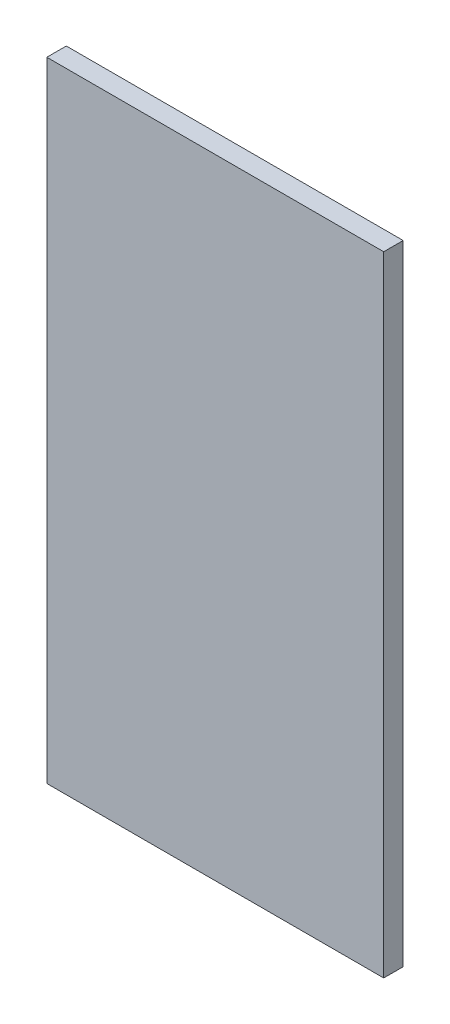
ISO-10303-21;
HEADER;
FILE_DESCRIPTION(('STEP AP214'),'2;1');
FILE_NAME('part.step','',(''),(''),'','','');
FILE_SCHEMA(('AUTOMOTIVE_DESIGN { 1 0 10303 214 1 1 1 1 }'));
ENDSEC;
DATA;
#1=APPLICATION_CONTEXT('core data for automotive mechanical design processes');
#2=APPLICATION_PROTOCOL_DEFINITION('international standard','automotive_design',2000,#1);
#3=PRODUCT_CONTEXT('',#1,'mechanical');
#4=PRODUCT('Part','Part','',(#3));
#5=PRODUCT_RELATED_PRODUCT_CATEGORY('part','',(#4));
#6=PRODUCT_DEFINITION_FORMATION('','',#4);
#7=PRODUCT_DEFINITION_CONTEXT('part definition',#1,'design');
#8=PRODUCT_DEFINITION('design','',#6,#7);
#9=PRODUCT_DEFINITION_SHAPE('','',#8);
#10=(LENGTH_UNIT() NAMED_UNIT(*) SI_UNIT(.MILLI.,.METRE.));
#11=(NAMED_UNIT(*) PLANE_ANGLE_UNIT() SI_UNIT($,.RADIAN.));
#12=(NAMED_UNIT(*) SI_UNIT($,.STERADIAN.) SOLID_ANGLE_UNIT());
#13=UNCERTAINTY_MEASURE_WITH_UNIT(LENGTH_MEASURE(1.E-05),#10,'distance_accuracy_value','');
#14=(GEOMETRIC_REPRESENTATION_CONTEXT(3) GLOBAL_UNCERTAINTY_ASSIGNED_CONTEXT((#13)) GLOBAL_UNIT_ASSIGNED_CONTEXT((#10,
#11,#12)) REPRESENTATION_CONTEXT('',''));
#15=CARTESIAN_POINT('',(0.,0.,0.));
#16=DIRECTION('',(0.,0.,1.));
#17=DIRECTION('',(1.,0.,0.));
#18=AXIS2_PLACEMENT_3D('',#15,#16,#17);
#19=CARTESIAN_POINT('',(-173.,323.,20.));
#20=DIRECTION('',(1.,0.,0.));
#21=DIRECTION('',(0.,0.,-1.));
#22=AXIS2_PLACEMENT_3D('',#19,#20,#21);
#23=PLANE('',#22);
#24=DIRECTION('',(0.,-1.,0.));
#25=VECTOR('',#24,1.);
#26=CARTESIAN_POINT('',(-173.,323.,0.));
#27=LINE('',#26,#25);
#28=CARTESIAN_POINT('',(-173.,323.,0.));
#29=VERTEX_POINT('',#28);
#30=CARTESIAN_POINT('',(-173.,-323.,0.));
#31=VERTEX_POINT('',#30);
#32=EDGE_CURVE('E96',#29,#31,#27,.T.);
#33=ORIENTED_EDGE('',*,*,#32,.T.);
#34=DIRECTION('',(0.,0.,-1.));
#35=VECTOR('',#34,1.);
#36=CARTESIAN_POINT('',(-173.,-323.,20.));
#37=LINE('',#36,#35);
#38=CARTESIAN_POINT('',(-173.,-323.,20.));
#39=VERTEX_POINT('',#38);
#40=EDGE_CURVE('E11',#39,#31,#37,.T.);
#41=ORIENTED_EDGE('',*,*,#40,.F.);
#42=DIRECTION('',(0.,-1.,0.));
#43=VECTOR('',#42,1.);
#44=CARTESIAN_POINT('',(-173.,323.,20.));
#45=LINE('',#44,#43);
#46=CARTESIAN_POINT('',(-173.,323.,20.));
#47=VERTEX_POINT('',#46);
#48=EDGE_CURVE('E84',#47,#39,#45,.T.);
#49=ORIENTED_EDGE('',*,*,#48,.F.);
#50=DIRECTION('',(0.,0.,-1.));
#51=VECTOR('',#50,1.);
#52=CARTESIAN_POINT('',(-173.,323.,20.));
#53=LINE('',#52,#51);
#54=EDGE_CURVE('E92',#47,#29,#53,.T.);
#55=ORIENTED_EDGE('',*,*,#54,.T.);
#56=EDGE_LOOP('',(#33,#41,#49,#55));
#57=FACE_BOUND('',#56,.T.);
#58=ADVANCED_FACE('F33',(#57),#23,.F.);
#59=CARTESIAN_POINT('',(-173.,-323.,20.));
#60=DIRECTION('',(0.,1.,0.));
#61=DIRECTION('',(0.,0.,1.));
#62=AXIS2_PLACEMENT_3D('',#59,#60,#61);
#63=PLANE('',#62);
#64=DIRECTION('',(1.,0.,0.));
#65=VECTOR('',#64,1.);
#66=CARTESIAN_POINT('',(-173.,-323.,0.));
#67=LINE('',#66,#65);
#68=CARTESIAN_POINT('',(173.,-323.,0.));
#69=VERTEX_POINT('',#68);
#70=EDGE_CURVE('E88',#31,#69,#67,.T.);
#71=ORIENTED_EDGE('',*,*,#70,.T.);
#72=DIRECTION('',(0.,0.,-1.));
#73=VECTOR('',#72,1.);
#74=CARTESIAN_POINT('',(173.,-323.,20.));
#75=LINE('',#74,#73);
#76=CARTESIAN_POINT('',(173.,-323.,20.));
#77=VERTEX_POINT('',#76);
#78=EDGE_CURVE('E41',#77,#69,#75,.T.);
#79=ORIENTED_EDGE('',*,*,#78,.F.);
#80=DIRECTION('',(1.,0.,0.));
#81=VECTOR('',#80,1.);
#82=CARTESIAN_POINT('',(-173.,-323.,20.));
#83=LINE('',#82,#81);
#84=EDGE_CURVE('E79',#39,#77,#83,.T.);
#85=ORIENTED_EDGE('',*,*,#84,.F.);
#86=ORIENTED_EDGE('',*,*,#40,.T.);
#87=EDGE_LOOP('',(#71,#79,#85,#86));
#88=FACE_BOUND('',#87,.T.);
#89=ADVANCED_FACE('F87',(#88),#63,.F.);
#90=CARTESIAN_POINT('',(173.,323.,20.));
#91=DIRECTION('',(-1.,0.,0.));
#92=DIRECTION('',(0.,0.,1.));
#93=AXIS2_PLACEMENT_3D('',#90,#91,#92);
#94=PLANE('',#93);
#95=DIRECTION('',(0.,1.,0.));
#96=VECTOR('',#95,1.);
#97=CARTESIAN_POINT('',(173.,323.,0.));
#98=LINE('',#97,#96);
#99=CARTESIAN_POINT('',(173.,323.,0.));
#100=VERTEX_POINT('',#99);
#101=EDGE_CURVE('E66',#69,#100,#98,.T.);
#102=ORIENTED_EDGE('',*,*,#101,.T.);
#103=DIRECTION('',(0.,0.,-1.));
#104=VECTOR('',#103,1.);
#105=CARTESIAN_POINT('',(173.,323.,20.));
#106=LINE('',#105,#104);
#107=CARTESIAN_POINT('',(173.,323.,20.));
#108=VERTEX_POINT('',#107);
#109=EDGE_CURVE('E89',#108,#100,#106,.T.);
#110=ORIENTED_EDGE('',*,*,#109,.F.);
#111=DIRECTION('',(0.,1.,0.));
#112=VECTOR('',#111,1.);
#113=CARTESIAN_POINT('',(173.,323.,20.));
#114=LINE('',#113,#112);
#115=EDGE_CURVE('E82',#77,#108,#114,.T.);
#116=ORIENTED_EDGE('',*,*,#115,.F.);
#117=ORIENTED_EDGE('',*,*,#78,.T.);
#118=EDGE_LOOP('',(#102,#110,#116,#117));
#119=FACE_BOUND('',#118,.T.);
#120=ADVANCED_FACE('F90',(#119),#94,.F.);
#121=CARTESIAN_POINT('',(-173.,323.,20.));
#122=DIRECTION('',(0.,-1.,0.));
#123=DIRECTION('',(0.,0.,-1.));
#124=AXIS2_PLACEMENT_3D('',#121,#122,#123);
#125=PLANE('',#124);
#126=DIRECTION('',(-1.,0.,0.));
#127=VECTOR('',#126,1.);
#128=CARTESIAN_POINT('',(-173.,323.,0.));
#129=LINE('',#128,#127);
#130=EDGE_CURVE('E72',#100,#29,#129,.T.);
#131=ORIENTED_EDGE('',*,*,#130,.T.);
#132=ORIENTED_EDGE('',*,*,#54,.F.);
#133=DIRECTION('',(-1.,0.,0.));
#134=VECTOR('',#133,1.);
#135=CARTESIAN_POINT('',(-173.,323.,20.));
#136=LINE('',#135,#134);
#137=EDGE_CURVE('E49',#108,#47,#136,.T.);
#138=ORIENTED_EDGE('',*,*,#137,.F.);
#139=ORIENTED_EDGE('',*,*,#109,.T.);
#140=EDGE_LOOP('',(#131,#132,#138,#139));
#141=FACE_BOUND('',#140,.T.);
#142=ADVANCED_FACE('F103',(#141),#125,.F.);
#143=CARTESIAN_POINT('',(0.,0.,20.));
#144=DIRECTION('',(0.,0.,1.));
#145=DIRECTION('',(1.,0.,0.));
#146=AXIS2_PLACEMENT_3D('',#143,#144,#145);
#147=PLANE('',#146);
#148=ORIENTED_EDGE('',*,*,#48,.T.);
#149=ORIENTED_EDGE('',*,*,#84,.T.);
#150=ORIENTED_EDGE('',*,*,#115,.T.);
#151=ORIENTED_EDGE('',*,*,#137,.T.);
#152=EDGE_LOOP('',(#148,#149,#150,#151));
#153=FACE_BOUND('',#152,.T.);
#154=ADVANCED_FACE('F80',(#153),#147,.T.);
#155=CARTESIAN_POINT('',(0.,0.,0.));
#156=DIRECTION('',(0.,0.,1.));
#157=DIRECTION('',(1.,0.,0.));
#158=AXIS2_PLACEMENT_3D('',#155,#156,#157);
#159=PLANE('',#158);
#160=ORIENTED_EDGE('',*,*,#32,.F.);
#161=ORIENTED_EDGE('',*,*,#130,.F.);
#162=ORIENTED_EDGE('',*,*,#101,.F.);
#163=ORIENTED_EDGE('',*,*,#70,.F.);
#164=EDGE_LOOP('',(#160,#161,#162,#163));
#165=FACE_BOUND('',#164,.T.);
#166=ADVANCED_FACE('F106',(#165),#159,.F.);
#167=CLOSED_SHELL('',(#58,#89,#120,#142,#154,#166));
#168=MANIFOLD_SOLID_BREP('B2',#167);
#169=ADVANCED_BREP_SHAPE_REPRESENTATION('',(#18,#168),#14);
#170=SHAPE_DEFINITION_REPRESENTATION(#9,#169);
ENDSEC;
END-ISO-10303-21;
